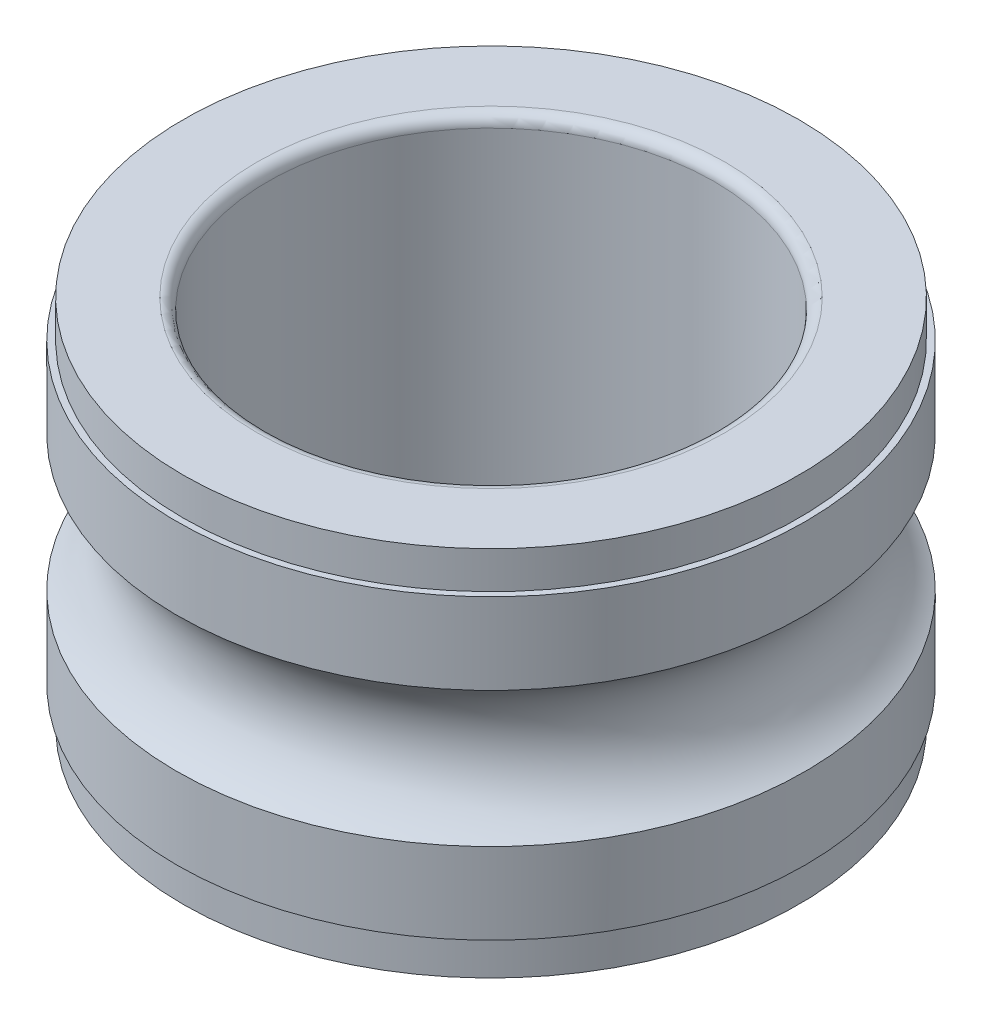
ISO-10303-21;
HEADER;
FILE_DESCRIPTION(('STEP AP214'),'2;1');
FILE_NAME('part.step','',(''),(''),'','','');
FILE_SCHEMA(('AUTOMOTIVE_DESIGN { 1 0 10303 214 1 1 1 1 }'));
ENDSEC;
DATA;
#1=APPLICATION_CONTEXT('core data for automotive mechanical design processes');
#2=APPLICATION_PROTOCOL_DEFINITION('international standard','automotive_design',2000,#1);
#3=PRODUCT_CONTEXT('',#1,'mechanical');
#4=PRODUCT('Part','Part','',(#3));
#5=PRODUCT_RELATED_PRODUCT_CATEGORY('part','',(#4));
#6=PRODUCT_DEFINITION_FORMATION('','',#4);
#7=PRODUCT_DEFINITION_CONTEXT('part definition',#1,'design');
#8=PRODUCT_DEFINITION('design','',#6,#7);
#9=PRODUCT_DEFINITION_SHAPE('','',#8);
#10=(LENGTH_UNIT() NAMED_UNIT(*) SI_UNIT(.MILLI.,.METRE.));
#11=(NAMED_UNIT(*) PLANE_ANGLE_UNIT() SI_UNIT($,.RADIAN.));
#12=(NAMED_UNIT(*) SI_UNIT($,.STERADIAN.) SOLID_ANGLE_UNIT());
#13=UNCERTAINTY_MEASURE_WITH_UNIT(LENGTH_MEASURE(1.E-05),#10,'distance_accuracy_value','');
#14=(GEOMETRIC_REPRESENTATION_CONTEXT(3) GLOBAL_UNCERTAINTY_ASSIGNED_CONTEXT((#13)) GLOBAL_UNIT_ASSIGNED_CONTEXT((#10,
#11,#12)) REPRESENTATION_CONTEXT('',''));
#15=CARTESIAN_POINT('',(0.,0.,0.));
#16=DIRECTION('',(0.,0.,1.));
#17=DIRECTION('',(1.,0.,0.));
#18=AXIS2_PLACEMENT_3D('',#15,#16,#17);
#19=CARTESIAN_POINT('',(0.,-1.04533666301317,0.));
#20=DIRECTION('',(0.,1.,0.));
#21=DIRECTION('',(0.,0.,1.));
#22=AXIS2_PLACEMENT_3D('',#19,#20,#21);
#23=CYLINDRICAL_SURFACE('',#22,4.225);
#24=CARTESIAN_POINT('',(0.,-0.5,0.));
#25=DIRECTION('',(0.,1.,0.));
#26=DIRECTION('',(0.,0.,1.));
#27=AXIS2_PLACEMENT_3D('',#24,#25,#26);
#28=CIRCLE('',#27,4.225);
#29=CARTESIAN_POINT('',(0.,-0.5,-4.225));
#30=VERTEX_POINT('',#29);
#31=EDGE_CURVE('E11',#30,#30,#28,.T.);
#32=ORIENTED_EDGE('',*,*,#31,.F.);
#33=EDGE_LOOP('',(#32));
#34=FACE_BOUND('',#33,.T.);
#35=CARTESIAN_POINT('',(0.,-1.59067332602634,0.));
#36=DIRECTION('',(0.,1.,0.));
#37=DIRECTION('',(0.,0.,1.));
#38=AXIS2_PLACEMENT_3D('',#35,#36,#37);
#39=CIRCLE('',#38,4.225);
#40=CARTESIAN_POINT('',(3.65895733098925,-1.59067332602634,2.1125));
#41=VERTEX_POINT('',#40);
#42=EDGE_CURVE('E87',#41,#41,#39,.T.);
#43=ORIENTED_EDGE('',*,*,#42,.T.);
#44=EDGE_LOOP('',(#43));
#45=FACE_BOUND('',#44,.T.);
#46=ADVANCED_FACE('F17',(#34,#45),#23,.T.);
#47=CARTESIAN_POINT('',(0.,-0.5,4.18275));
#48=DIRECTION('',(0.,1.,0.));
#49=DIRECTION('',(1.,0.,0.));
#50=AXIS2_PLACEMENT_3D('',#47,#48,#49);
#51=PLANE('',#50);
#52=ORIENTED_EDGE('',*,*,#31,.T.);
#53=EDGE_LOOP('',(#52));
#54=FACE_BOUND('',#53,.T.);
#55=CARTESIAN_POINT('',(0.,-0.5,0.));
#56=DIRECTION('',(0.,1.,0.));
#57=DIRECTION('',(0.,0.,1.));
#58=AXIS2_PLACEMENT_3D('',#55,#56,#57);
#59=CIRCLE('',#58,4.1405);
#60=CARTESIAN_POINT('',(0.,-0.5,-4.1405));
#61=VERTEX_POINT('',#60);
#62=EDGE_CURVE('E94',#61,#61,#59,.T.);
#63=ORIENTED_EDGE('',*,*,#62,.F.);
#64=EDGE_LOOP('',(#63));
#65=FACE_BOUND('',#64,.T.);
#66=ADVANCED_FACE('F199',(#54,#65),#51,.T.);
#67=CARTESIAN_POINT('',(0.,-3.95466333698683,0.));
#68=DIRECTION('',(0.,1.,0.));
#69=DIRECTION('',(0.,0.,1.));
#70=AXIS2_PLACEMENT_3D('',#67,#68,#69);
#71=CYLINDRICAL_SURFACE('',#70,4.225);
#72=CARTESIAN_POINT('',(0.,-3.40932667397366,0.));
#73=DIRECTION('',(0.,1.,0.));
#74=DIRECTION('',(0.,0.,1.));
#75=AXIS2_PLACEMENT_3D('',#72,#73,#74);
#76=CIRCLE('',#75,4.225);
#77=CARTESIAN_POINT('',(2.1125,-3.40932667397366,3.65895733098926));
#78=VERTEX_POINT('',#77);
#79=EDGE_CURVE('E20',#78,#78,#76,.T.);
#80=ORIENTED_EDGE('',*,*,#79,.F.);
#81=EDGE_LOOP('',(#80));
#82=FACE_BOUND('',#81,.T.);
#83=CARTESIAN_POINT('',(0.,-4.5,0.));
#84=DIRECTION('',(0.,1.,0.));
#85=DIRECTION('',(0.,0.,1.));
#86=AXIS2_PLACEMENT_3D('',#83,#84,#85);
#87=CIRCLE('',#86,4.225);
#88=CARTESIAN_POINT('',(0.,-4.5,-4.225));
#89=VERTEX_POINT('',#88);
#90=EDGE_CURVE('E27',#89,#89,#87,.T.);
#91=ORIENTED_EDGE('',*,*,#90,.T.);
#92=EDGE_LOOP('',(#91));
#93=FACE_BOUND('',#92,.T.);
#94=ADVANCED_FACE('F194',(#82,#93),#71,.T.);
#95=CARTESIAN_POINT('',(0.,-4.5,4.18275));
#96=DIRECTION('',(0.,-1.,0.));
#97=DIRECTION('',(-1.,0.,0.));
#98=AXIS2_PLACEMENT_3D('',#95,#96,#97);
#99=PLANE('',#98);
#100=CARTESIAN_POINT('',(0.,-4.5,0.));
#101=DIRECTION('',(0.,1.,0.));
#102=DIRECTION('',(0.,0.,1.));
#103=AXIS2_PLACEMENT_3D('',#100,#101,#102);
#104=CIRCLE('',#103,4.1405);
#105=CARTESIAN_POINT('',(0.,-4.5,-4.1405));
#106=VERTEX_POINT('',#105);
#107=EDGE_CURVE('E101',#106,#106,#104,.T.);
#108=ORIENTED_EDGE('',*,*,#107,.T.);
#109=EDGE_LOOP('',(#108));
#110=FACE_BOUND('',#109,.T.);
#111=ORIENTED_EDGE('',*,*,#90,.F.);
#112=EDGE_LOOP('',(#111));
#113=FACE_BOUND('',#112,.T.);
#114=ADVANCED_FACE('F198',(#110,#113),#99,.T.);
#115=CARTESIAN_POINT('',(0.,-2.5,0.));
#116=DIRECTION('',(0.,1.,0.));
#117=DIRECTION('',(0.,0.,1.));
#118=AXIS2_PLACEMENT_3D('',#115,#116,#117);
#119=TOROIDAL_SURFACE('',#118,4.75,1.05);
#120=ORIENTED_EDGE('',*,*,#79,.T.);
#121=EDGE_LOOP('',(#120));
#122=FACE_BOUND('',#121,.T.);
#123=ORIENTED_EDGE('',*,*,#42,.F.);
#124=EDGE_LOOP('',(#123));
#125=FACE_BOUND('',#124,.T.);
#126=ADVANCED_FACE('F218',(#122,#125),#119,.F.);
#127=CARTESIAN_POINT('',(0.,-0.25,0.));
#128=DIRECTION('',(0.,1.,0.));
#129=DIRECTION('',(0.,0.,1.));
#130=AXIS2_PLACEMENT_3D('',#127,#128,#129);
#131=CYLINDRICAL_SURFACE('',#130,4.1405);
#132=CARTESIAN_POINT('',(0.,0.,0.));
#133=DIRECTION('',(0.,1.,0.));
#134=DIRECTION('',(0.,0.,1.));
#135=AXIS2_PLACEMENT_3D('',#132,#133,#134);
#136=CIRCLE('',#135,4.1405);
#137=CARTESIAN_POINT('',(0.,0.,-4.1405));
#138=VERTEX_POINT('',#137);
#139=EDGE_CURVE('E108',#138,#138,#136,.T.);
#140=ORIENTED_EDGE('',*,*,#139,.F.);
#141=EDGE_LOOP('',(#140));
#142=FACE_BOUND('',#141,.T.);
#143=ORIENTED_EDGE('',*,*,#62,.T.);
#144=EDGE_LOOP('',(#143));
#145=FACE_BOUND('',#144,.T.);
#146=ADVANCED_FACE('F188',(#142,#145),#131,.T.);
#147=CARTESIAN_POINT('',(0.,-4.75,0.));
#148=DIRECTION('',(0.,1.,0.));
#149=DIRECTION('',(0.,0.,1.));
#150=AXIS2_PLACEMENT_3D('',#147,#148,#149);
#151=CYLINDRICAL_SURFACE('',#150,4.1405);
#152=ORIENTED_EDGE('',*,*,#107,.F.);
#153=EDGE_LOOP('',(#152));
#154=FACE_BOUND('',#153,.T.);
#155=CARTESIAN_POINT('',(0.,-5.,0.));
#156=DIRECTION('',(0.,1.,0.));
#157=DIRECTION('',(0.,0.,1.));
#158=AXIS2_PLACEMENT_3D('',#155,#156,#157);
#159=CIRCLE('',#158,4.1405);
#160=CARTESIAN_POINT('',(0.,-5.,-4.1405));
#161=VERTEX_POINT('',#160);
#162=EDGE_CURVE('E113',#161,#161,#159,.T.);
#163=ORIENTED_EDGE('',*,*,#162,.T.);
#164=EDGE_LOOP('',(#163));
#165=FACE_BOUND('',#164,.T.);
#166=ADVANCED_FACE('F180',(#154,#165),#151,.T.);
#167=CARTESIAN_POINT('',(0.,0.,3.64525));
#168=DIRECTION('',(0.,1.,0.));
#169=DIRECTION('',(1.,0.,0.));
#170=AXIS2_PLACEMENT_3D('',#167,#168,#169);
#171=PLANE('',#170);
#172=ORIENTED_EDGE('',*,*,#139,.T.);
#173=EDGE_LOOP('',(#172));
#174=FACE_BOUND('',#173,.T.);
#175=CARTESIAN_POINT('',(0.,0.,0.));
#176=DIRECTION('',(0.,1.,0.));
#177=DIRECTION('',(0.,0.,1.));
#178=AXIS2_PLACEMENT_3D('',#175,#176,#177);
#179=CIRCLE('',#178,3.15);
#180=CARTESIAN_POINT('',(0.,0.,-3.15));
#181=VERTEX_POINT('',#180);
#182=EDGE_CURVE('E122',#181,#181,#179,.T.);
#183=ORIENTED_EDGE('',*,*,#182,.F.);
#184=EDGE_LOOP('',(#183));
#185=FACE_BOUND('',#184,.T.);
#186=ADVANCED_FACE('F109',(#174,#185),#171,.T.);
#187=CARTESIAN_POINT('',(0.,-5.,3.64525));
#188=DIRECTION('',(0.,-1.,0.));
#189=DIRECTION('',(-1.,0.,0.));
#190=AXIS2_PLACEMENT_3D('',#187,#188,#189);
#191=PLANE('',#190);
#192=CARTESIAN_POINT('',(0.,-5.,0.));
#193=DIRECTION('',(0.,1.,0.));
#194=DIRECTION('',(0.,0.,1.));
#195=AXIS2_PLACEMENT_3D('',#192,#193,#194);
#196=CIRCLE('',#195,3.15);
#197=CARTESIAN_POINT('',(0.,-5.,-3.15));
#198=VERTEX_POINT('',#197);
#199=EDGE_CURVE('E130',#198,#198,#196,.T.);
#200=ORIENTED_EDGE('',*,*,#199,.T.);
#201=EDGE_LOOP('',(#200));
#202=FACE_BOUND('',#201,.T.);
#203=ORIENTED_EDGE('',*,*,#162,.F.);
#204=EDGE_LOOP('',(#203));
#205=FACE_BOUND('',#204,.T.);
#206=ADVANCED_FACE('F179',(#202,#205),#191,.T.);
#207=CARTESIAN_POINT('',(0.,-0.15,0.));
#208=DIRECTION('',(0.,1.,0.));
#209=DIRECTION('',(0.,0.,1.));
#210=AXIS2_PLACEMENT_3D('',#207,#208,#209);
#211=TOROIDAL_SURFACE('',#210,3.15,0.15);
#212=CARTESIAN_POINT('',(0.,-0.15,0.));
#213=DIRECTION('',(0.,1.,0.));
#214=DIRECTION('',(0.,0.,1.));
#215=AXIS2_PLACEMENT_3D('',#212,#213,#214);
#216=CIRCLE('',#215,3.);
#217=CARTESIAN_POINT('',(0.,-0.15,-3.));
#218=VERTEX_POINT('',#217);
#219=EDGE_CURVE('E60',#218,#218,#216,.T.);
#220=ORIENTED_EDGE('',*,*,#219,.F.);
#221=EDGE_LOOP('',(#220));
#222=FACE_BOUND('',#221,.T.);
#223=ORIENTED_EDGE('',*,*,#182,.T.);
#224=EDGE_LOOP('',(#223));
#225=FACE_BOUND('',#224,.T.);
#226=ADVANCED_FACE('F226',(#222,#225),#211,.T.);
#227=CARTESIAN_POINT('',(0.,-4.85,0.));
#228=DIRECTION('',(0.,1.,0.));
#229=DIRECTION('',(0.,0.,1.));
#230=AXIS2_PLACEMENT_3D('',#227,#228,#229);
#231=TOROIDAL_SURFACE('',#230,3.15,0.15);
#232=ORIENTED_EDGE('',*,*,#199,.F.);
#233=EDGE_LOOP('',(#232));
#234=FACE_BOUND('',#233,.T.);
#235=CARTESIAN_POINT('',(0.,-4.85,0.));
#236=DIRECTION('',(0.,1.,0.));
#237=DIRECTION('',(0.,0.,1.));
#238=AXIS2_PLACEMENT_3D('',#235,#236,#237);
#239=CIRCLE('',#238,3.);
#240=CARTESIAN_POINT('',(0.,-4.85,-3.));
#241=VERTEX_POINT('',#240);
#242=EDGE_CURVE('E70',#241,#241,#239,.T.);
#243=ORIENTED_EDGE('',*,*,#242,.T.);
#244=EDGE_LOOP('',(#243));
#245=FACE_BOUND('',#244,.T.);
#246=ADVANCED_FACE('F209',(#234,#245),#231,.T.);
#247=CARTESIAN_POINT('',(0.,-2.5,0.));
#248=DIRECTION('',(0.,1.,0.));
#249=DIRECTION('',(0.,0.,1.));
#250=AXIS2_PLACEMENT_3D('',#247,#248,#249);
#251=CYLINDRICAL_SURFACE('',#250,3.);
#252=ORIENTED_EDGE('',*,*,#242,.F.);
#253=EDGE_LOOP('',(#252));
#254=FACE_BOUND('',#253,.T.);
#255=ORIENTED_EDGE('',*,*,#219,.T.);
#256=EDGE_LOOP('',(#255));
#257=FACE_BOUND('',#256,.T.);
#258=ADVANCED_FACE('F205',(#254,#257),#251,.F.);
#259=CLOSED_SHELL('',(#46,#66,#94,#114,#126,#146,#166,#186,#206,#226,#246,#258));
#260=MANIFOLD_SOLID_BREP('B1',#259);
#261=ADVANCED_BREP_SHAPE_REPRESENTATION('',(#18,#260),#14);
#262=SHAPE_DEFINITION_REPRESENTATION(#9,#261);
ENDSEC;
END-ISO-10303-21;
